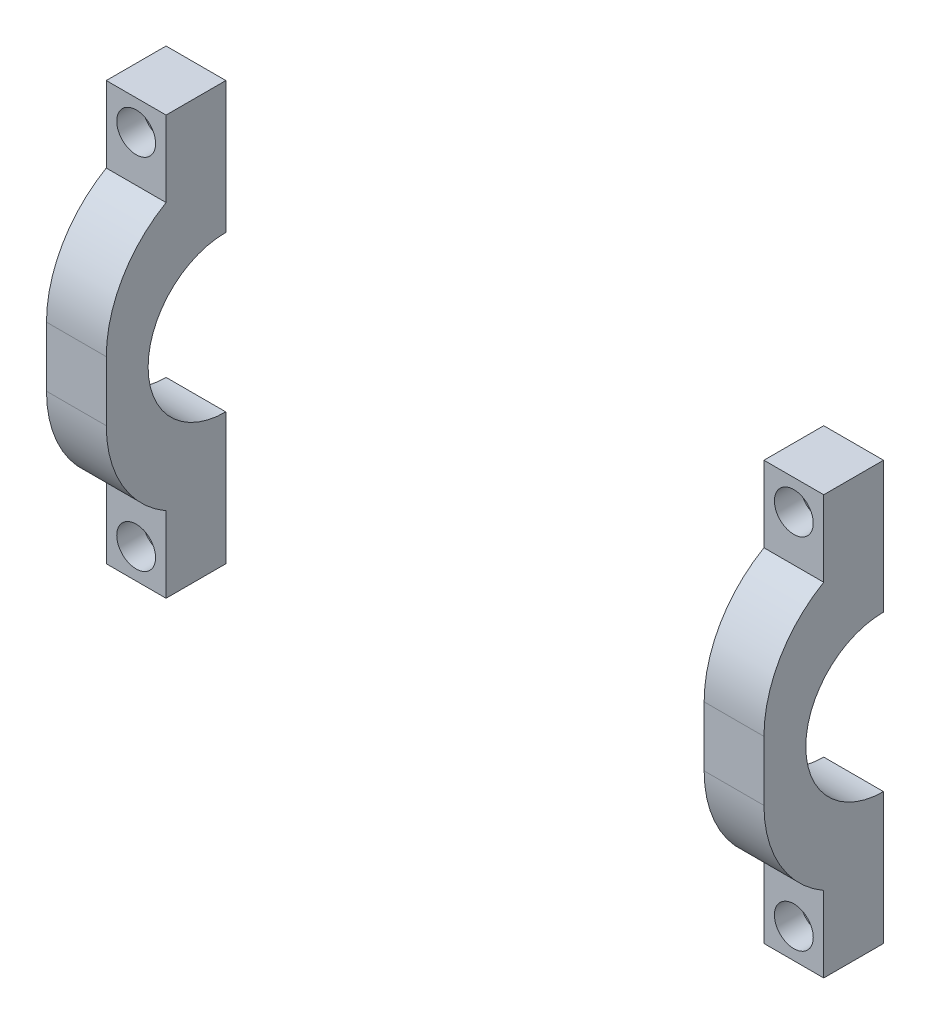
ISO-10303-21;
HEADER;
FILE_DESCRIPTION(('STEP AP214'),'2;1');
FILE_NAME('part.step','',(''),(''),'','','');
FILE_SCHEMA(('AUTOMOTIVE_DESIGN { 1 0 10303 214 1 1 1 1 }'));
ENDSEC;
DATA;
#1=APPLICATION_CONTEXT('core data for automotive mechanical design processes');
#2=APPLICATION_PROTOCOL_DEFINITION('international standard','automotive_design',2000,#1);
#3=PRODUCT_CONTEXT('',#1,'mechanical');
#4=PRODUCT('Part','Part','',(#3));
#5=PRODUCT_RELATED_PRODUCT_CATEGORY('part','',(#4));
#6=PRODUCT_DEFINITION_FORMATION('','',#4);
#7=PRODUCT_DEFINITION_CONTEXT('part definition',#1,'design');
#8=PRODUCT_DEFINITION('design','',#6,#7);
#9=PRODUCT_DEFINITION_SHAPE('','',#8);
#10=(LENGTH_UNIT() NAMED_UNIT(*) SI_UNIT(.MILLI.,.METRE.));
#11=(NAMED_UNIT(*) PLANE_ANGLE_UNIT() SI_UNIT($,.RADIAN.));
#12=(NAMED_UNIT(*) SI_UNIT($,.STERADIAN.) SOLID_ANGLE_UNIT());
#13=UNCERTAINTY_MEASURE_WITH_UNIT(LENGTH_MEASURE(1.E-05),#10,'distance_accuracy_value','');
#14=(GEOMETRIC_REPRESENTATION_CONTEXT(3) GLOBAL_UNCERTAINTY_ASSIGNED_CONTEXT((#13)) GLOBAL_UNIT_ASSIGNED_CONTEXT((#10,
#11,#12)) REPRESENTATION_CONTEXT('',''));
#15=CARTESIAN_POINT('',(0.,0.,0.));
#16=DIRECTION('',(0.,0.,1.));
#17=DIRECTION('',(1.,0.,0.));
#18=AXIS2_PLACEMENT_3D('',#15,#16,#17);
#19=CARTESIAN_POINT('',(-55.,-30.,70.));
#20=DIRECTION('',(0.,0.,-1.));
#21=DIRECTION('',(-1.,0.,0.));
#22=AXIS2_PLACEMENT_3D('',#19,#20,#21);
#23=CYLINDRICAL_SURFACE('',#22,1.7);
#24=CARTESIAN_POINT('',(-55.,-30.,50.));
#25=DIRECTION('',(0.,0.,1.));
#26=DIRECTION('',(1.,0.,0.));
#27=AXIS2_PLACEMENT_3D('',#24,#25,#26);
#28=CIRCLE('',#27,1.7);
#29=CARTESIAN_POINT('',(-53.3,-30.,50.));
#30=VERTEX_POINT('',#29);
#31=EDGE_CURVE('E189',#30,#30,#28,.F.);
#32=ORIENTED_EDGE('',*,*,#31,.T.);
#33=EDGE_LOOP('',(#32));
#34=FACE_BOUND('',#33,.T.);
#35=CARTESIAN_POINT('',(-55.,-30.,55.6));
#36=DIRECTION('',(0.,0.,1.));
#37=DIRECTION('',(1.,0.,0.));
#38=AXIS2_PLACEMENT_3D('',#35,#36,#37);
#39=CIRCLE('',#38,1.7);
#40=CARTESIAN_POINT('',(-53.3,-30.,55.6));
#41=VERTEX_POINT('',#40);
#42=EDGE_CURVE('E188',#41,#41,#39,.F.);
#43=ORIENTED_EDGE('',*,*,#42,.F.);
#44=EDGE_LOOP('',(#43));
#45=FACE_BOUND('',#44,.T.);
#46=ADVANCED_FACE('F52',(#34,#45),#23,.F.);
#47=CARTESIAN_POINT('',(-60.,-5.,50.));
#48=DIRECTION('',(1.,0.,0.));
#49=DIRECTION('',(0.,0.,-1.));
#50=AXIS2_PLACEMENT_3D('',#47,#48,#49);
#51=CYLINDRICAL_SURFACE('',#50,20.);
#52=CARTESIAN_POINT('',(-60.,-5.,50.));
#53=DIRECTION('',(1.,0.,0.));
#54=DIRECTION('',(0.,0.,-1.));
#55=AXIS2_PLACEMENT_3D('',#52,#53,#54);
#56=CIRCLE('',#55,20.);
#57=CARTESIAN_POINT('',(-60.,-22.3205080756888,60.));
#58=VERTEX_POINT('',#57);
#59=CARTESIAN_POINT('',(-60.,-5.,70.));
#60=VERTEX_POINT('',#59);
#61=EDGE_CURVE('E183',#58,#60,#56,.F.);
#62=ORIENTED_EDGE('',*,*,#61,.F.);
#63=DIRECTION('',(1.,0.,0.));
#64=VECTOR('',#63,1.);
#65=CARTESIAN_POINT('',(-60.,-22.3205080756888,60.));
#66=LINE('',#65,#64);
#67=CARTESIAN_POINT('',(-50.,-22.3205080756888,60.));
#68=VERTEX_POINT('',#67);
#69=EDGE_CURVE('E192',#58,#68,#66,.T.);
#70=ORIENTED_EDGE('',*,*,#69,.T.);
#71=CARTESIAN_POINT('',(-50.,-5.,50.));
#72=DIRECTION('',(-1.,0.,0.));
#73=DIRECTION('',(0.,0.,1.));
#74=AXIS2_PLACEMENT_3D('',#71,#72,#73);
#75=CIRCLE('',#74,20.);
#76=CARTESIAN_POINT('',(-50.,-5.,70.));
#77=VERTEX_POINT('',#76);
#78=EDGE_CURVE('E171',#77,#68,#75,.F.);
#79=ORIENTED_EDGE('',*,*,#78,.F.);
#80=DIRECTION('',(1.,0.,0.));
#81=VECTOR('',#80,1.);
#82=CARTESIAN_POINT('',(-60.,-5.,70.));
#83=LINE('',#82,#81);
#84=EDGE_CURVE('E232',#60,#77,#83,.T.);
#85=ORIENTED_EDGE('',*,*,#84,.F.);
#86=EDGE_LOOP('',(#62,#70,#79,#85));
#87=FACE_BOUND('',#86,.T.);
#88=ADVANCED_FACE('F244',(#87),#51,.T.);
#89=CARTESIAN_POINT('',(-55.,30.,70.));
#90=DIRECTION('',(0.,0.,-1.));
#91=DIRECTION('',(-1.,0.,0.));
#92=AXIS2_PLACEMENT_3D('',#89,#90,#91);
#93=CYLINDRICAL_SURFACE('',#92,1.7);
#94=CARTESIAN_POINT('',(-55.,30.,50.));
#95=DIRECTION('',(0.,0.,1.));
#96=DIRECTION('',(1.,0.,0.));
#97=AXIS2_PLACEMENT_3D('',#94,#95,#96);
#98=CIRCLE('',#97,1.7);
#99=CARTESIAN_POINT('',(-53.3,30.,50.));
#100=VERTEX_POINT('',#99);
#101=EDGE_CURVE('E193',#100,#100,#98,.T.);
#102=ORIENTED_EDGE('',*,*,#101,.F.);
#103=EDGE_LOOP('',(#102));
#104=FACE_BOUND('',#103,.T.);
#105=CARTESIAN_POINT('',(-55.,30.,55.6));
#106=DIRECTION('',(0.,0.,1.));
#107=DIRECTION('',(1.,0.,0.));
#108=AXIS2_PLACEMENT_3D('',#105,#106,#107);
#109=CIRCLE('',#108,1.7);
#110=CARTESIAN_POINT('',(-53.3,30.,55.6));
#111=VERTEX_POINT('',#110);
#112=EDGE_CURVE('E220',#111,#111,#109,.T.);
#113=ORIENTED_EDGE('',*,*,#112,.T.);
#114=EDGE_LOOP('',(#113));
#115=FACE_BOUND('',#114,.T.);
#116=ADVANCED_FACE('F261',(#104,#115),#93,.F.);
#117=CARTESIAN_POINT('',(-60.,25.,0.));
#118=DIRECTION('',(1.,0.,0.));
#119=DIRECTION('',(0.,0.,-1.));
#120=AXIS2_PLACEMENT_3D('',#117,#118,#119);
#121=PLANE('',#120);
#122=DIRECTION('',(0.,0.,1.));
#123=VECTOR('',#122,1.);
#124=CARTESIAN_POINT('',(-60.,35.,40.));
#125=LINE('',#124,#123);
#126=CARTESIAN_POINT('',(-60.,35.,50.));
#127=VERTEX_POINT('',#126);
#128=CARTESIAN_POINT('',(-60.,35.,60.));
#129=VERTEX_POINT('',#128);
#130=EDGE_CURVE('E137',#127,#129,#125,.T.);
#131=ORIENTED_EDGE('',*,*,#130,.F.);
#132=DIRECTION('',(0.,1.,0.));
#133=VECTOR('',#132,1.);
#134=CARTESIAN_POINT('',(-60.,-35.,50.));
#135=LINE('',#134,#133);
#136=CARTESIAN_POINT('',(-60.,13.,50.));
#137=VERTEX_POINT('',#136);
#138=EDGE_CURVE('E61',#137,#127,#135,.T.);
#139=ORIENTED_EDGE('',*,*,#138,.F.);
#140=CARTESIAN_POINT('',(-60.,0.,50.));
#141=DIRECTION('',(1.,0.,0.));
#142=DIRECTION('',(0.,0.,-1.));
#143=AXIS2_PLACEMENT_3D('',#140,#141,#142);
#144=CIRCLE('',#143,13.);
#145=CARTESIAN_POINT('',(-60.,-13.,50.));
#146=VERTEX_POINT('',#145);
#147=EDGE_CURVE('E184',#137,#146,#144,.T.);
#148=ORIENTED_EDGE('',*,*,#147,.T.);
#149=CARTESIAN_POINT('',(-60.,-35.,50.));
#150=VERTEX_POINT('',#149);
#151=EDGE_CURVE('E84',#150,#146,#135,.T.);
#152=ORIENTED_EDGE('',*,*,#151,.F.);
#153=DIRECTION('',(0.,0.,1.));
#154=VECTOR('',#153,1.);
#155=CARTESIAN_POINT('',(-60.,-35.,40.));
#156=LINE('',#155,#154);
#157=CARTESIAN_POINT('',(-60.,-35.,60.));
#158=VERTEX_POINT('',#157);
#159=EDGE_CURVE('E181',#150,#158,#156,.T.);
#160=ORIENTED_EDGE('',*,*,#159,.T.);
#161=DIRECTION('',(0.,-1.,0.));
#162=VECTOR('',#161,1.);
#163=CARTESIAN_POINT('',(-60.,-15.,60.));
#164=LINE('',#163,#162);
#165=EDGE_CURVE('E172',#58,#158,#164,.T.);
#166=ORIENTED_EDGE('',*,*,#165,.F.);
#167=ORIENTED_EDGE('',*,*,#61,.T.);
#168=DIRECTION('',(0.,-1.,0.));
#169=VECTOR('',#168,1.);
#170=CARTESIAN_POINT('',(-60.,25.,70.));
#171=LINE('',#170,#169);
#172=CARTESIAN_POINT('',(-60.,5.,70.));
#173=VERTEX_POINT('',#172);
#174=EDGE_CURVE('E157',#173,#60,#171,.T.);
#175=ORIENTED_EDGE('',*,*,#174,.F.);
#176=CARTESIAN_POINT('',(-60.,5.,50.));
#177=DIRECTION('',(1.,0.,0.));
#178=DIRECTION('',(0.,0.,-1.));
#179=AXIS2_PLACEMENT_3D('',#176,#177,#178);
#180=CIRCLE('',#179,20.);
#181=CARTESIAN_POINT('',(-60.,22.3205080756888,60.));
#182=VERTEX_POINT('',#181);
#183=EDGE_CURVE('E154',#173,#182,#180,.F.);
#184=ORIENTED_EDGE('',*,*,#183,.T.);
#185=DIRECTION('',(0.,1.,0.));
#186=VECTOR('',#185,1.);
#187=CARTESIAN_POINT('',(-60.,15.,60.));
#188=LINE('',#187,#186);
#189=EDGE_CURVE('E150',#182,#129,#188,.T.);
#190=ORIENTED_EDGE('',*,*,#189,.T.);
#191=EDGE_LOOP('',(#131,#139,#148,#152,#160,#166,#167,#175,#184,#190));
#192=FACE_BOUND('',#191,.T.);
#193=ADVANCED_FACE('F151',(#192),#121,.F.);
#194=CARTESIAN_POINT('',(-60.,25.,70.));
#195=DIRECTION('',(0.,0.,-1.));
#196=DIRECTION('',(-1.,0.,0.));
#197=AXIS2_PLACEMENT_3D('',#194,#195,#196);
#198=PLANE('',#197);
#199=ORIENTED_EDGE('',*,*,#174,.T.);
#200=ORIENTED_EDGE('',*,*,#84,.T.);
#201=DIRECTION('',(0.,-1.,0.));
#202=VECTOR('',#201,1.);
#203=CARTESIAN_POINT('',(-50.,25.,70.));
#204=LINE('',#203,#202);
#205=CARTESIAN_POINT('',(-50.,5.,70.));
#206=VERTEX_POINT('',#205);
#207=EDGE_CURVE('E218',#206,#77,#204,.T.);
#208=ORIENTED_EDGE('',*,*,#207,.F.);
#209=DIRECTION('',(1.,0.,0.));
#210=VECTOR('',#209,1.);
#211=CARTESIAN_POINT('',(-60.,5.,70.));
#212=LINE('',#211,#210);
#213=EDGE_CURVE('E180',#206,#173,#212,.F.);
#214=ORIENTED_EDGE('',*,*,#213,.T.);
#215=EDGE_LOOP('',(#199,#200,#208,#214));
#216=FACE_BOUND('',#215,.T.);
#217=ADVANCED_FACE('F238',(#216),#198,.F.);
#218=CARTESIAN_POINT('',(-50.,25.,70.));
#219=DIRECTION('',(-1.,0.,0.));
#220=DIRECTION('',(0.,0.,1.));
#221=AXIS2_PLACEMENT_3D('',#218,#219,#220);
#222=PLANE('',#221);
#223=DIRECTION('',(0.,0.,-1.));
#224=VECTOR('',#223,1.);
#225=CARTESIAN_POINT('',(-50.,-35.,40.));
#226=LINE('',#225,#224);
#227=CARTESIAN_POINT('',(-50.,-35.,60.));
#228=VERTEX_POINT('',#227);
#229=CARTESIAN_POINT('',(-50.,-35.,50.));
#230=VERTEX_POINT('',#229);
#231=EDGE_CURVE('E177',#228,#230,#226,.T.);
#232=ORIENTED_EDGE('',*,*,#231,.T.);
#233=DIRECTION('',(0.,1.,0.));
#234=VECTOR('',#233,1.);
#235=CARTESIAN_POINT('',(-50.,25.,50.));
#236=LINE('',#235,#234);
#237=CARTESIAN_POINT('',(-50.,-13.,50.));
#238=VERTEX_POINT('',#237);
#239=EDGE_CURVE('E179',#230,#238,#236,.T.);
#240=ORIENTED_EDGE('',*,*,#239,.T.);
#241=CARTESIAN_POINT('',(-50.,0.,50.));
#242=DIRECTION('',(-1.,0.,0.));
#243=DIRECTION('',(0.,0.,1.));
#244=AXIS2_PLACEMENT_3D('',#241,#242,#243);
#245=CIRCLE('',#244,13.);
#246=CARTESIAN_POINT('',(-50.,13.,50.));
#247=VERTEX_POINT('',#246);
#248=EDGE_CURVE('E199',#238,#247,#245,.T.);
#249=ORIENTED_EDGE('',*,*,#248,.T.);
#250=CARTESIAN_POINT('',(-50.,35.,50.));
#251=VERTEX_POINT('',#250);
#252=EDGE_CURVE('E68',#247,#251,#236,.T.);
#253=ORIENTED_EDGE('',*,*,#252,.T.);
#254=DIRECTION('',(0.,0.,-1.));
#255=VECTOR('',#254,1.);
#256=CARTESIAN_POINT('',(-50.,35.,40.));
#257=LINE('',#256,#255);
#258=CARTESIAN_POINT('',(-50.,35.,60.));
#259=VERTEX_POINT('',#258);
#260=EDGE_CURVE('E160',#259,#251,#257,.T.);
#261=ORIENTED_EDGE('',*,*,#260,.F.);
#262=DIRECTION('',(0.,1.,0.));
#263=VECTOR('',#262,1.);
#264=CARTESIAN_POINT('',(-50.,15.,60.));
#265=LINE('',#264,#263);
#266=CARTESIAN_POINT('',(-50.,22.3205080756888,60.));
#267=VERTEX_POINT('',#266);
#268=EDGE_CURVE('E146',#267,#259,#265,.T.);
#269=ORIENTED_EDGE('',*,*,#268,.F.);
#270=CARTESIAN_POINT('',(-50.,5.,50.));
#271=DIRECTION('',(-1.,0.,0.));
#272=DIRECTION('',(0.,0.,1.));
#273=AXIS2_PLACEMENT_3D('',#270,#271,#272);
#274=CIRCLE('',#273,20.);
#275=EDGE_CURVE('E123',#267,#206,#274,.F.);
#276=ORIENTED_EDGE('',*,*,#275,.T.);
#277=ORIENTED_EDGE('',*,*,#207,.T.);
#278=ORIENTED_EDGE('',*,*,#78,.T.);
#279=DIRECTION('',(0.,-1.,0.));
#280=VECTOR('',#279,1.);
#281=CARTESIAN_POINT('',(-50.,-15.,60.));
#282=LINE('',#281,#280);
#283=EDGE_CURVE('E97',#68,#228,#282,.T.);
#284=ORIENTED_EDGE('',*,*,#283,.T.);
#285=EDGE_LOOP('',(#232,#240,#249,#253,#261,#269,#276,#277,#278,#284));
#286=FACE_BOUND('',#285,.T.);
#287=ADVANCED_FACE('F208',(#286),#222,.F.);
#288=CARTESIAN_POINT('',(0.,5.,50.));
#289=DIRECTION('',(-1.,0.,0.));
#290=DIRECTION('',(0.,0.,1.));
#291=AXIS2_PLACEMENT_3D('',#288,#289,#290);
#292=CYLINDRICAL_SURFACE('',#291,20.);
#293=DIRECTION('',(-1.,0.,0.));
#294=VECTOR('',#293,1.);
#295=CARTESIAN_POINT('',(0.,22.3205080756888,60.));
#296=LINE('',#295,#294);
#297=EDGE_CURVE('E221',#182,#267,#296,.F.);
#298=ORIENTED_EDGE('',*,*,#297,.F.);
#299=ORIENTED_EDGE('',*,*,#183,.F.);
#300=ORIENTED_EDGE('',*,*,#213,.F.);
#301=ORIENTED_EDGE('',*,*,#275,.F.);
#302=EDGE_LOOP('',(#298,#299,#300,#301));
#303=FACE_BOUND('',#302,.T.);
#304=ADVANCED_FACE('F246',(#303),#292,.T.);
#305=CARTESIAN_POINT('',(-60.,0.,50.));
#306=DIRECTION('',(1.,0.,0.));
#307=DIRECTION('',(0.,0.,-1.));
#308=AXIS2_PLACEMENT_3D('',#305,#306,#307);
#309=CYLINDRICAL_SURFACE('',#308,13.);
#310=ORIENTED_EDGE('',*,*,#248,.F.);
#311=DIRECTION('',(1.,0.,0.));
#312=VECTOR('',#311,1.);
#313=CARTESIAN_POINT('',(-60.,-13.,50.));
#314=LINE('',#313,#312);
#315=EDGE_CURVE('E170',#238,#146,#314,.F.);
#316=ORIENTED_EDGE('',*,*,#315,.T.);
#317=ORIENTED_EDGE('',*,*,#147,.F.);
#318=DIRECTION('',(1.,0.,0.));
#319=VECTOR('',#318,1.);
#320=CARTESIAN_POINT('',(-60.,13.,50.));
#321=LINE('',#320,#319);
#322=EDGE_CURVE('E197',#137,#247,#321,.T.);
#323=ORIENTED_EDGE('',*,*,#322,.T.);
#324=EDGE_LOOP('',(#310,#316,#317,#323));
#325=FACE_BOUND('',#324,.T.);
#326=ADVANCED_FACE('F212',(#325),#309,.F.);
#327=CARTESIAN_POINT('',(-60.,15.,60.));
#328=DIRECTION('',(0.,0.,1.));
#329=DIRECTION('',(1.,0.,0.));
#330=AXIS2_PLACEMENT_3D('',#327,#328,#329);
#331=PLANE('',#330);
#332=CARTESIAN_POINT('',(-55.,30.,60.));
#333=DIRECTION('',(0.,0.,1.));
#334=DIRECTION('',(1.,0.,0.));
#335=AXIS2_PLACEMENT_3D('',#332,#333,#334);
#336=CIRCLE('',#335,3.25);
#337=CARTESIAN_POINT('',(-51.75,30.,60.));
#338=VERTEX_POINT('',#337);
#339=EDGE_CURVE('E201',#338,#338,#336,.F.);
#340=ORIENTED_EDGE('',*,*,#339,.T.);
#341=EDGE_LOOP('',(#340));
#342=FACE_BOUND('',#341,.T.);
#343=ORIENTED_EDGE('',*,*,#189,.F.);
#344=ORIENTED_EDGE('',*,*,#297,.T.);
#345=ORIENTED_EDGE('',*,*,#268,.T.);
#346=DIRECTION('',(1.,0.,0.));
#347=VECTOR('',#346,1.);
#348=CARTESIAN_POINT('',(-60.,35.,60.));
#349=LINE('',#348,#347);
#350=EDGE_CURVE('E142',#129,#259,#349,.T.);
#351=ORIENTED_EDGE('',*,*,#350,.F.);
#352=EDGE_LOOP('',(#343,#344,#345,#351));
#353=FACE_BOUND('',#352,.T.);
#354=ADVANCED_FACE('F159',(#342,#353),#331,.T.);
#355=CARTESIAN_POINT('',(0.,35.,0.));
#356=DIRECTION('',(0.,1.,0.));
#357=DIRECTION('',(0.,0.,1.));
#358=AXIS2_PLACEMENT_3D('',#355,#356,#357);
#359=PLANE('',#358);
#360=DIRECTION('',(1.,0.,0.));
#361=VECTOR('',#360,1.);
#362=CARTESIAN_POINT('',(-60.,35.,50.));
#363=LINE('',#362,#361);
#364=EDGE_CURVE('E12',#127,#251,#363,.T.);
#365=ORIENTED_EDGE('',*,*,#364,.F.);
#366=ORIENTED_EDGE('',*,*,#130,.T.);
#367=ORIENTED_EDGE('',*,*,#350,.T.);
#368=ORIENTED_EDGE('',*,*,#260,.T.);
#369=EDGE_LOOP('',(#365,#366,#367,#368));
#370=FACE_BOUND('',#369,.T.);
#371=ADVANCED_FACE('F139',(#370),#359,.T.);
#372=CARTESIAN_POINT('',(-55.,30.,70.));
#373=DIRECTION('',(0.,0.,-1.));
#374=DIRECTION('',(-1.,0.,0.));
#375=AXIS2_PLACEMENT_3D('',#372,#373,#374);
#376=CYLINDRICAL_SURFACE('',#375,3.25);
#377=ORIENTED_EDGE('',*,*,#339,.F.);
#378=EDGE_LOOP('',(#377));
#379=FACE_BOUND('',#378,.T.);
#380=CARTESIAN_POINT('',(-55.,30.,55.6));
#381=DIRECTION('',(0.,0.,1.));
#382=DIRECTION('',(1.,0.,0.));
#383=AXIS2_PLACEMENT_3D('',#380,#381,#382);
#384=CIRCLE('',#383,3.25);
#385=CARTESIAN_POINT('',(-51.75,30.,55.6));
#386=VERTEX_POINT('',#385);
#387=EDGE_CURVE('E162',#386,#386,#384,.T.);
#388=ORIENTED_EDGE('',*,*,#387,.F.);
#389=EDGE_LOOP('',(#388));
#390=FACE_BOUND('',#389,.T.);
#391=ADVANCED_FACE('F292',(#379,#390),#376,.F.);
#392=CARTESIAN_POINT('',(-55.,30.,55.6));
#393=DIRECTION('',(0.,0.,1.));
#394=DIRECTION('',(1.,0.,0.));
#395=AXIS2_PLACEMENT_3D('',#392,#393,#394);
#396=PLANE('',#395);
#397=ORIENTED_EDGE('',*,*,#112,.F.);
#398=EDGE_LOOP('',(#397));
#399=FACE_BOUND('',#398,.T.);
#400=ORIENTED_EDGE('',*,*,#387,.T.);
#401=EDGE_LOOP('',(#400));
#402=FACE_BOUND('',#401,.T.);
#403=ADVANCED_FACE('F288',(#399,#402),#396,.T.);
#404=CARTESIAN_POINT('',(-60.,-15.,60.));
#405=DIRECTION('',(0.,0.,-1.));
#406=DIRECTION('',(-1.,0.,0.));
#407=AXIS2_PLACEMENT_3D('',#404,#405,#406);
#408=PLANE('',#407);
#409=CARTESIAN_POINT('',(-55.,-30.,60.));
#410=DIRECTION('',(0.,0.,-1.));
#411=DIRECTION('',(-1.,0.,0.));
#412=AXIS2_PLACEMENT_3D('',#409,#410,#411);
#413=CIRCLE('',#412,3.25);
#414=CARTESIAN_POINT('',(-58.25,-30.,60.));
#415=VERTEX_POINT('',#414);
#416=EDGE_CURVE('E168',#415,#415,#413,.T.);
#417=ORIENTED_EDGE('',*,*,#416,.T.);
#418=EDGE_LOOP('',(#417));
#419=FACE_BOUND('',#418,.T.);
#420=ORIENTED_EDGE('',*,*,#69,.F.);
#421=ORIENTED_EDGE('',*,*,#165,.T.);
#422=DIRECTION('',(1.,0.,0.));
#423=VECTOR('',#422,1.);
#424=CARTESIAN_POINT('',(-60.,-35.,60.));
#425=LINE('',#424,#423);
#426=EDGE_CURVE('E175',#158,#228,#425,.T.);
#427=ORIENTED_EDGE('',*,*,#426,.T.);
#428=ORIENTED_EDGE('',*,*,#283,.F.);
#429=EDGE_LOOP('',(#420,#421,#427,#428));
#430=FACE_BOUND('',#429,.T.);
#431=ADVANCED_FACE('F291',(#419,#430),#408,.F.);
#432=CARTESIAN_POINT('',(0.,-35.,0.));
#433=DIRECTION('',(0.,-1.,0.));
#434=DIRECTION('',(0.,0.,1.));
#435=AXIS2_PLACEMENT_3D('',#432,#433,#434);
#436=PLANE('',#435);
#437=DIRECTION('',(1.,0.,0.));
#438=VECTOR('',#437,1.);
#439=CARTESIAN_POINT('',(-60.,-35.,50.));
#440=LINE('',#439,#438);
#441=EDGE_CURVE('E89',#150,#230,#440,.T.);
#442=ORIENTED_EDGE('',*,*,#441,.T.);
#443=ORIENTED_EDGE('',*,*,#231,.F.);
#444=ORIENTED_EDGE('',*,*,#426,.F.);
#445=ORIENTED_EDGE('',*,*,#159,.F.);
#446=EDGE_LOOP('',(#442,#443,#444,#445));
#447=FACE_BOUND('',#446,.T.);
#448=ADVANCED_FACE('F204',(#447),#436,.T.);
#449=CARTESIAN_POINT('',(-55.,-30.,70.));
#450=DIRECTION('',(0.,0.,-1.));
#451=DIRECTION('',(-1.,0.,0.));
#452=AXIS2_PLACEMENT_3D('',#449,#450,#451);
#453=CYLINDRICAL_SURFACE('',#452,3.25);
#454=CARTESIAN_POINT('',(-55.,-30.,55.6));
#455=DIRECTION('',(0.,0.,-1.));
#456=DIRECTION('',(1.,0.,0.));
#457=AXIS2_PLACEMENT_3D('',#454,#455,#456);
#458=CIRCLE('',#457,3.25);
#459=CARTESIAN_POINT('',(-51.75,-30.,55.6));
#460=VERTEX_POINT('',#459);
#461=EDGE_CURVE('E185',#460,#460,#458,.T.);
#462=ORIENTED_EDGE('',*,*,#461,.T.);
#463=EDGE_LOOP('',(#462));
#464=FACE_BOUND('',#463,.T.);
#465=ORIENTED_EDGE('',*,*,#416,.F.);
#466=EDGE_LOOP('',(#465));
#467=FACE_BOUND('',#466,.T.);
#468=ADVANCED_FACE('F266',(#464,#467),#453,.F.);
#469=CARTESIAN_POINT('',(-55.,-30.,55.6));
#470=DIRECTION('',(0.,0.,1.));
#471=DIRECTION('',(1.,0.,0.));
#472=AXIS2_PLACEMENT_3D('',#469,#470,#471);
#473=PLANE('',#472);
#474=ORIENTED_EDGE('',*,*,#461,.F.);
#475=EDGE_LOOP('',(#474));
#476=FACE_BOUND('',#475,.T.);
#477=ORIENTED_EDGE('',*,*,#42,.T.);
#478=EDGE_LOOP('',(#477));
#479=FACE_BOUND('',#478,.T.);
#480=ADVANCED_FACE('F269',(#476,#479),#473,.T.);
#481=CARTESIAN_POINT('',(-60.,-35.,50.));
#482=DIRECTION('',(0.,0.,1.));
#483=DIRECTION('',(1.,0.,0.));
#484=AXIS2_PLACEMENT_3D('',#481,#482,#483);
#485=PLANE('',#484);
#486=ORIENTED_EDGE('',*,*,#441,.F.);
#487=ORIENTED_EDGE('',*,*,#151,.T.);
#488=ORIENTED_EDGE('',*,*,#315,.F.);
#489=ORIENTED_EDGE('',*,*,#239,.F.);
#490=EDGE_LOOP('',(#486,#487,#488,#489));
#491=FACE_BOUND('',#490,.T.);
#492=ORIENTED_EDGE('',*,*,#31,.F.);
#493=EDGE_LOOP('',(#492));
#494=FACE_BOUND('',#493,.T.);
#495=ADVANCED_FACE('F54',(#491,#494),#485,.F.);
#496=ORIENTED_EDGE('',*,*,#101,.T.);
#497=EDGE_LOOP('',(#496));
#498=FACE_BOUND('',#497,.T.);
#499=ORIENTED_EDGE('',*,*,#322,.F.);
#500=ORIENTED_EDGE('',*,*,#138,.T.);
#501=ORIENTED_EDGE('',*,*,#364,.T.);
#502=ORIENTED_EDGE('',*,*,#252,.F.);
#503=EDGE_LOOP('',(#499,#500,#501,#502));
#504=FACE_BOUND('',#503,.T.);
#505=ADVANCED_FACE('F276',(#498,#504),#485,.F.);
#506=CLOSED_SHELL('',(#46,#88,#116,#193,#217,#287,#304,#326,#354,#371,#391,#403,#431,#448,#468,
#480,#495,#505));
#507=MANIFOLD_SOLID_BREP('B2',#506);
#508=CARTESIAN_POINT('',(55.,30.,55.6));
#509=DIRECTION('',(0.,0.,1.));
#510=DIRECTION('',(-1.,0.,0.));
#511=AXIS2_PLACEMENT_3D('',#508,#509,#510);
#512=PLANE('',#511);
#513=CARTESIAN_POINT('',(55.,30.,55.6));
#514=DIRECTION('',(0.,0.,-1.));
#515=DIRECTION('',(-1.,0.,0.));
#516=AXIS2_PLACEMENT_3D('',#513,#514,#515);
#517=CIRCLE('',#516,3.25);
#518=CARTESIAN_POINT('',(51.75,30.,55.6));
#519=VERTEX_POINT('',#518);
#520=EDGE_CURVE('E587',#519,#519,#517,.T.);
#521=ORIENTED_EDGE('',*,*,#520,.F.);
#522=EDGE_LOOP('',(#521));
#523=FACE_BOUND('',#522,.T.);
#524=CARTESIAN_POINT('',(55.,30.,55.6));
#525=DIRECTION('',(0.,0.,1.));
#526=DIRECTION('',(1.,0.,0.));
#527=AXIS2_PLACEMENT_3D('',#524,#525,#526);
#528=CIRCLE('',#527,1.7);
#529=CARTESIAN_POINT('',(56.7,30.,55.6));
#530=VERTEX_POINT('',#529);
#531=EDGE_CURVE('E583',#530,#530,#528,.F.);
#532=ORIENTED_EDGE('',*,*,#531,.T.);
#533=EDGE_LOOP('',(#532));
#534=FACE_BOUND('',#533,.T.);
#535=ADVANCED_FACE('F442',(#523,#534),#512,.T.);
#536=CARTESIAN_POINT('',(55.,30.,70.));
#537=DIRECTION('',(0.,0.,-1.));
#538=DIRECTION('',(-1.,0.,0.));
#539=AXIS2_PLACEMENT_3D('',#536,#537,#538);
#540=CYLINDRICAL_SURFACE('',#539,1.7);
#541=CARTESIAN_POINT('',(55.,30.,50.));
#542=DIRECTION('',(0.,0.,1.));
#543=DIRECTION('',(1.,0.,0.));
#544=AXIS2_PLACEMENT_3D('',#541,#542,#543);
#545=CIRCLE('',#544,1.7);
#546=CARTESIAN_POINT('',(56.7,30.,50.));
#547=VERTEX_POINT('',#546);
#548=EDGE_CURVE('E626',#547,#547,#545,.F.);
#549=ORIENTED_EDGE('',*,*,#548,.T.);
#550=EDGE_LOOP('',(#549));
#551=FACE_BOUND('',#550,.T.);
#552=ORIENTED_EDGE('',*,*,#531,.F.);
#553=EDGE_LOOP('',(#552));
#554=FACE_BOUND('',#553,.T.);
#555=ADVANCED_FACE('F649',(#551,#554),#540,.F.);
#556=CARTESIAN_POINT('',(55.,30.,70.));
#557=DIRECTION('',(0.,0.,-1.));
#558=DIRECTION('',(-1.,0.,0.));
#559=AXIS2_PLACEMENT_3D('',#556,#557,#558);
#560=CYLINDRICAL_SURFACE('',#559,3.25);
#561=ORIENTED_EDGE('',*,*,#520,.T.);
#562=EDGE_LOOP('',(#561));
#563=FACE_BOUND('',#562,.T.);
#564=CARTESIAN_POINT('',(55.,30.,60.));
#565=DIRECTION('',(0.,0.,-1.));
#566=DIRECTION('',(-1.,0.,0.));
#567=AXIS2_PLACEMENT_3D('',#564,#565,#566);
#568=CIRCLE('',#567,3.25);
#569=CARTESIAN_POINT('',(51.75,30.,60.));
#570=VERTEX_POINT('',#569);
#571=EDGE_CURVE('E586',#570,#570,#568,.T.);
#572=ORIENTED_EDGE('',*,*,#571,.F.);
#573=EDGE_LOOP('',(#572));
#574=FACE_BOUND('',#573,.T.);
#575=ADVANCED_FACE('F657',(#563,#574),#560,.F.);
#576=CARTESIAN_POINT('',(55.,-30.,55.6));
#577=DIRECTION('',(0.,0.,1.));
#578=DIRECTION('',(-1.,0.,0.));
#579=AXIS2_PLACEMENT_3D('',#576,#577,#578);
#580=PLANE('',#579);
#581=CARTESIAN_POINT('',(55.,-30.,55.6));
#582=DIRECTION('',(0.,0.,1.));
#583=DIRECTION('',(1.,0.,0.));
#584=AXIS2_PLACEMENT_3D('',#581,#582,#583);
#585=CIRCLE('',#584,1.7);
#586=CARTESIAN_POINT('',(56.7,-30.,55.6));
#587=VERTEX_POINT('',#586);
#588=EDGE_CURVE('E591',#587,#587,#585,.T.);
#589=ORIENTED_EDGE('',*,*,#588,.F.);
#590=EDGE_LOOP('',(#589));
#591=FACE_BOUND('',#590,.T.);
#592=CARTESIAN_POINT('',(55.,-30.,55.6));
#593=DIRECTION('',(0.,0.,1.));
#594=DIRECTION('',(-1.,0.,0.));
#595=AXIS2_PLACEMENT_3D('',#592,#593,#594);
#596=CIRCLE('',#595,3.25);
#597=CARTESIAN_POINT('',(51.75,-30.,55.6));
#598=VERTEX_POINT('',#597);
#599=EDGE_CURVE('E594',#598,#598,#596,.T.);
#600=ORIENTED_EDGE('',*,*,#599,.T.);
#601=EDGE_LOOP('',(#600));
#602=FACE_BOUND('',#601,.T.);
#603=ADVANCED_FACE('F665',(#591,#602),#580,.T.);
#604=CARTESIAN_POINT('',(55.,-30.,70.));
#605=DIRECTION('',(0.,0.,-1.));
#606=DIRECTION('',(-1.,0.,0.));
#607=AXIS2_PLACEMENT_3D('',#604,#605,#606);
#608=CYLINDRICAL_SURFACE('',#607,1.7);
#609=CARTESIAN_POINT('',(55.,-30.,50.));
#610=DIRECTION('',(0.,0.,1.));
#611=DIRECTION('',(1.,0.,0.));
#612=AXIS2_PLACEMENT_3D('',#609,#610,#611);
#613=CIRCLE('',#612,1.7);
#614=CARTESIAN_POINT('',(56.7,-30.,50.));
#615=VERTEX_POINT('',#614);
#616=EDGE_CURVE('E630',#615,#615,#613,.T.);
#617=ORIENTED_EDGE('',*,*,#616,.F.);
#618=EDGE_LOOP('',(#617));
#619=FACE_BOUND('',#618,.T.);
#620=ORIENTED_EDGE('',*,*,#588,.T.);
#621=EDGE_LOOP('',(#620));
#622=FACE_BOUND('',#621,.T.);
#623=ADVANCED_FACE('F666',(#619,#622),#608,.F.);
#624=CARTESIAN_POINT('',(55.,-30.,70.));
#625=DIRECTION('',(0.,0.,-1.));
#626=DIRECTION('',(-1.,0.,0.));
#627=AXIS2_PLACEMENT_3D('',#624,#625,#626);
#628=CYLINDRICAL_SURFACE('',#627,3.25);
#629=CARTESIAN_POINT('',(55.,-30.,60.));
#630=DIRECTION('',(0.,0.,1.));
#631=DIRECTION('',(1.,0.,0.));
#632=AXIS2_PLACEMENT_3D('',#629,#630,#631);
#633=CIRCLE('',#632,3.25);
#634=CARTESIAN_POINT('',(58.25,-30.,60.));
#635=VERTEX_POINT('',#634);
#636=EDGE_CURVE('E593',#635,#635,#633,.F.);
#637=ORIENTED_EDGE('',*,*,#636,.F.);
#638=EDGE_LOOP('',(#637));
#639=FACE_BOUND('',#638,.T.);
#640=ORIENTED_EDGE('',*,*,#599,.F.);
#641=EDGE_LOOP('',(#640));
#642=FACE_BOUND('',#641,.T.);
#643=ADVANCED_FACE('F663',(#639,#642),#628,.F.);
#644=CARTESIAN_POINT('',(50.,-5.,50.));
#645=DIRECTION('',(1.,0.,0.));
#646=DIRECTION('',(0.,0.,-1.));
#647=AXIS2_PLACEMENT_3D('',#644,#645,#646);
#648=CYLINDRICAL_SURFACE('',#647,20.);
#649=DIRECTION('',(1.,0.,0.));
#650=VECTOR('',#649,1.);
#651=CARTESIAN_POINT('',(50.,-22.3205080756888,60.));
#652=LINE('',#651,#650);
#653=CARTESIAN_POINT('',(60.,-22.3205080756888,60.));
#654=VERTEX_POINT('',#653);
#655=CARTESIAN_POINT('',(50.,-22.3205080756888,60.));
#656=VERTEX_POINT('',#655);
#657=EDGE_CURVE('E450',#654,#656,#652,.F.);
#658=ORIENTED_EDGE('',*,*,#657,.F.);
#659=CARTESIAN_POINT('',(60.,-5.,50.));
#660=DIRECTION('',(-1.,0.,0.));
#661=DIRECTION('',(0.,0.,1.));
#662=AXIS2_PLACEMENT_3D('',#659,#660,#661);
#663=CIRCLE('',#662,20.);
#664=CARTESIAN_POINT('',(60.,-5.,70.));
#665=VERTEX_POINT('',#664);
#666=EDGE_CURVE('E563',#665,#654,#663,.F.);
#667=ORIENTED_EDGE('',*,*,#666,.F.);
#668=DIRECTION('',(1.,0.,0.));
#669=VECTOR('',#668,1.);
#670=CARTESIAN_POINT('',(50.,-5.,70.));
#671=LINE('',#670,#669);
#672=CARTESIAN_POINT('',(50.,-5.,70.));
#673=VERTEX_POINT('',#672);
#674=EDGE_CURVE('E568',#673,#665,#671,.T.);
#675=ORIENTED_EDGE('',*,*,#674,.F.);
#676=CARTESIAN_POINT('',(50.,-5.,50.));
#677=DIRECTION('',(1.,0.,0.));
#678=DIRECTION('',(0.,0.,-1.));
#679=AXIS2_PLACEMENT_3D('',#676,#677,#678);
#680=CIRCLE('',#679,20.);
#681=EDGE_CURVE('E573',#656,#673,#680,.F.);
#682=ORIENTED_EDGE('',*,*,#681,.F.);
#683=EDGE_LOOP('',(#658,#667,#675,#682));
#684=FACE_BOUND('',#683,.T.);
#685=ADVANCED_FACE('F444',(#684),#648,.T.);
#686=CARTESIAN_POINT('',(50.,25.,70.));
#687=DIRECTION('',(0.,0.,-1.));
#688=DIRECTION('',(-1.,0.,0.));
#689=AXIS2_PLACEMENT_3D('',#686,#687,#688);
#690=PLANE('',#689);
#691=DIRECTION('',(0.,-1.,0.));
#692=VECTOR('',#691,1.);
#693=CARTESIAN_POINT('',(60.,25.,70.));
#694=LINE('',#693,#692);
#695=CARTESIAN_POINT('',(60.,5.,70.));
#696=VERTEX_POINT('',#695);
#697=EDGE_CURVE('E557',#696,#665,#694,.T.);
#698=ORIENTED_EDGE('',*,*,#697,.F.);
#699=DIRECTION('',(1.,0.,0.));
#700=VECTOR('',#699,1.);
#701=CARTESIAN_POINT('',(50.,5.,70.));
#702=LINE('',#701,#700);
#703=CARTESIAN_POINT('',(50.,5.,70.));
#704=VERTEX_POINT('',#703);
#705=EDGE_CURVE('E571',#696,#704,#702,.F.);
#706=ORIENTED_EDGE('',*,*,#705,.T.);
#707=DIRECTION('',(0.,-1.,0.));
#708=VECTOR('',#707,1.);
#709=CARTESIAN_POINT('',(50.,25.,70.));
#710=LINE('',#709,#708);
#711=EDGE_CURVE('E560',#704,#673,#710,.T.);
#712=ORIENTED_EDGE('',*,*,#711,.T.);
#713=ORIENTED_EDGE('',*,*,#674,.T.);
#714=EDGE_LOOP('',(#698,#706,#712,#713));
#715=FACE_BOUND('',#714,.T.);
#716=ADVANCED_FACE('F685',(#715),#690,.F.);
#717=CARTESIAN_POINT('',(0.,5.,50.));
#718=DIRECTION('',(-1.,0.,0.));
#719=DIRECTION('',(0.,0.,1.));
#720=AXIS2_PLACEMENT_3D('',#717,#718,#719);
#721=CYLINDRICAL_SURFACE('',#720,20.);
#722=CARTESIAN_POINT('',(60.,5.,50.));
#723=DIRECTION('',(-1.,0.,0.));
#724=DIRECTION('',(0.,0.,1.));
#725=AXIS2_PLACEMENT_3D('',#722,#723,#724);
#726=CIRCLE('',#725,20.);
#727=CARTESIAN_POINT('',(60.,22.3205080756888,60.));
#728=VERTEX_POINT('',#727);
#729=EDGE_CURVE('E566',#728,#696,#726,.F.);
#730=ORIENTED_EDGE('',*,*,#729,.F.);
#731=DIRECTION('',(-1.,0.,0.));
#732=VECTOR('',#731,1.);
#733=CARTESIAN_POINT('',(0.,22.3205080756888,60.));
#734=LINE('',#733,#732);
#735=CARTESIAN_POINT('',(50.,22.3205080756888,60.));
#736=VERTEX_POINT('',#735);
#737=EDGE_CURVE('E578',#728,#736,#734,.T.);
#738=ORIENTED_EDGE('',*,*,#737,.T.);
#739=CARTESIAN_POINT('',(50.,5.,50.));
#740=DIRECTION('',(1.,0.,0.));
#741=DIRECTION('',(0.,0.,-1.));
#742=AXIS2_PLACEMENT_3D('',#739,#740,#741);
#743=CIRCLE('',#742,20.);
#744=EDGE_CURVE('E575',#704,#736,#743,.F.);
#745=ORIENTED_EDGE('',*,*,#744,.F.);
#746=ORIENTED_EDGE('',*,*,#705,.F.);
#747=EDGE_LOOP('',(#730,#738,#745,#746));
#748=FACE_BOUND('',#747,.T.);
#749=ADVANCED_FACE('F679',(#748),#721,.T.);
#750=CARTESIAN_POINT('',(60.,15.,60.));
#751=DIRECTION('',(0.,0.,-1.));
#752=DIRECTION('',(-1.,0.,0.));
#753=AXIS2_PLACEMENT_3D('',#750,#751,#752);
#754=PLANE('',#753);
#755=ORIENTED_EDGE('',*,*,#571,.T.);
#756=EDGE_LOOP('',(#755));
#757=FACE_BOUND('',#756,.T.);
#758=ORIENTED_EDGE('',*,*,#737,.F.);
#759=DIRECTION('',(0.,1.,0.));
#760=VECTOR('',#759,1.);
#761=CARTESIAN_POINT('',(60.,15.,60.));
#762=LINE('',#761,#760);
#763=CARTESIAN_POINT('',(60.,35.,60.));
#764=VERTEX_POINT('',#763);
#765=EDGE_CURVE('E550',#728,#764,#762,.T.);
#766=ORIENTED_EDGE('',*,*,#765,.T.);
#767=DIRECTION('',(-1.,0.,0.));
#768=VECTOR('',#767,1.);
#769=CARTESIAN_POINT('',(60.,35.,60.));
#770=LINE('',#769,#768);
#771=CARTESIAN_POINT('',(50.,35.,60.));
#772=VERTEX_POINT('',#771);
#773=EDGE_CURVE('E539',#764,#772,#770,.T.);
#774=ORIENTED_EDGE('',*,*,#773,.T.);
#775=DIRECTION('',(0.,1.,0.));
#776=VECTOR('',#775,1.);
#777=CARTESIAN_POINT('',(50.,15.,60.));
#778=LINE('',#777,#776);
#779=EDGE_CURVE('E549',#736,#772,#778,.T.);
#780=ORIENTED_EDGE('',*,*,#779,.F.);
#781=EDGE_LOOP('',(#758,#766,#774,#780));
#782=FACE_BOUND('',#781,.T.);
#783=ADVANCED_FACE('F674',(#757,#782),#754,.F.);
#784=CARTESIAN_POINT('',(60.,-15.,60.));
#785=DIRECTION('',(0.,0.,1.));
#786=DIRECTION('',(1.,0.,0.));
#787=AXIS2_PLACEMENT_3D('',#784,#785,#786);
#788=PLANE('',#787);
#789=ORIENTED_EDGE('',*,*,#636,.T.);
#790=EDGE_LOOP('',(#789));
#791=FACE_BOUND('',#790,.T.);
#792=DIRECTION('',(0.,-1.,0.));
#793=VECTOR('',#792,1.);
#794=CARTESIAN_POINT('',(60.,-15.,60.));
#795=LINE('',#794,#793);
#796=CARTESIAN_POINT('',(60.,-35.,60.));
#797=VERTEX_POINT('',#796);
#798=EDGE_CURVE('E544',#654,#797,#795,.T.);
#799=ORIENTED_EDGE('',*,*,#798,.F.);
#800=ORIENTED_EDGE('',*,*,#657,.T.);
#801=DIRECTION('',(0.,-1.,0.));
#802=VECTOR('',#801,1.);
#803=CARTESIAN_POINT('',(50.,-15.,60.));
#804=LINE('',#803,#802);
#805=CARTESIAN_POINT('',(50.,-35.,60.));
#806=VERTEX_POINT('',#805);
#807=EDGE_CURVE('E541',#656,#806,#804,.T.);
#808=ORIENTED_EDGE('',*,*,#807,.T.);
#809=DIRECTION('',(-1.,0.,0.));
#810=VECTOR('',#809,1.);
#811=CARTESIAN_POINT('',(60.,-35.,60.));
#812=LINE('',#811,#810);
#813=EDGE_CURVE('E606',#797,#806,#812,.T.);
#814=ORIENTED_EDGE('',*,*,#813,.F.);
#815=EDGE_LOOP('',(#799,#800,#808,#814));
#816=FACE_BOUND('',#815,.T.);
#817=ADVANCED_FACE('F617',(#791,#816),#788,.T.);
#818=CARTESIAN_POINT('',(0.,35.,0.));
#819=DIRECTION('',(0.,1.,0.));
#820=DIRECTION('',(0.,0.,1.));
#821=AXIS2_PLACEMENT_3D('',#818,#819,#820);
#822=PLANE('',#821);
#823=DIRECTION('',(1.,0.,0.));
#824=VECTOR('',#823,1.);
#825=CARTESIAN_POINT('',(-60.,35.,50.));
#826=LINE('',#825,#824);
#827=CARTESIAN_POINT('',(50.,35.,50.));
#828=VERTEX_POINT('',#827);
#829=CARTESIAN_POINT('',(60.,35.,50.));
#830=VERTEX_POINT('',#829);
#831=EDGE_CURVE('E515',#828,#830,#826,.T.);
#832=ORIENTED_EDGE('',*,*,#831,.F.);
#833=DIRECTION('',(0.,0.,-1.));
#834=VECTOR('',#833,1.);
#835=CARTESIAN_POINT('',(50.,35.,40.));
#836=LINE('',#835,#834);
#837=EDGE_CURVE('E540',#772,#828,#836,.T.);
#838=ORIENTED_EDGE('',*,*,#837,.F.);
#839=ORIENTED_EDGE('',*,*,#773,.F.);
#840=DIRECTION('',(0.,0.,1.));
#841=VECTOR('',#840,1.);
#842=CARTESIAN_POINT('',(60.,35.,40.));
#843=LINE('',#842,#841);
#844=EDGE_CURVE('E531',#830,#764,#843,.T.);
#845=ORIENTED_EDGE('',*,*,#844,.F.);
#846=EDGE_LOOP('',(#832,#838,#839,#845));
#847=FACE_BOUND('',#846,.T.);
#848=ADVANCED_FACE('F537',(#847),#822,.T.);
#849=CARTESIAN_POINT('',(-60.,0.,50.));
#850=DIRECTION('',(1.,0.,0.));
#851=DIRECTION('',(0.,0.,-1.));
#852=AXIS2_PLACEMENT_3D('',#849,#850,#851);
#853=CYLINDRICAL_SURFACE('',#852,13.);
#854=CARTESIAN_POINT('',(60.,0.,50.));
#855=DIRECTION('',(1.,0.,0.));
#856=DIRECTION('',(0.,0.,-1.));
#857=AXIS2_PLACEMENT_3D('',#854,#855,#856);
#858=CIRCLE('',#857,13.);
#859=CARTESIAN_POINT('',(60.,13.,50.));
#860=VERTEX_POINT('',#859);
#861=CARTESIAN_POINT('',(60.,-13.,50.));
#862=VERTEX_POINT('',#861);
#863=EDGE_CURVE('E534',#860,#862,#858,.T.);
#864=ORIENTED_EDGE('',*,*,#863,.T.);
#865=DIRECTION('',(1.,0.,0.));
#866=VECTOR('',#865,1.);
#867=CARTESIAN_POINT('',(-60.,-13.,50.));
#868=LINE('',#867,#866);
#869=CARTESIAN_POINT('',(50.,-13.,50.));
#870=VERTEX_POINT('',#869);
#871=EDGE_CURVE('E627',#862,#870,#868,.F.);
#872=ORIENTED_EDGE('',*,*,#871,.T.);
#873=CARTESIAN_POINT('',(50.,0.,50.));
#874=DIRECTION('',(1.,0.,0.));
#875=DIRECTION('',(0.,0.,-1.));
#876=AXIS2_PLACEMENT_3D('',#873,#874,#875);
#877=CIRCLE('',#876,13.);
#878=CARTESIAN_POINT('',(50.,13.,50.));
#879=VERTEX_POINT('',#878);
#880=EDGE_CURVE('E554',#879,#870,#877,.T.);
#881=ORIENTED_EDGE('',*,*,#880,.F.);
#882=DIRECTION('',(1.,0.,0.));
#883=VECTOR('',#882,1.);
#884=CARTESIAN_POINT('',(-60.,13.,50.));
#885=LINE('',#884,#883);
#886=EDGE_CURVE('E634',#879,#860,#885,.T.);
#887=ORIENTED_EDGE('',*,*,#886,.T.);
#888=EDGE_LOOP('',(#864,#872,#881,#887));
#889=FACE_BOUND('',#888,.T.);
#890=ADVANCED_FACE('F636',(#889),#853,.F.);
#891=CARTESIAN_POINT('',(0.,-35.,0.));
#892=DIRECTION('',(0.,-1.,0.));
#893=DIRECTION('',(0.,0.,1.));
#894=AXIS2_PLACEMENT_3D('',#891,#892,#893);
#895=PLANE('',#894);
#896=DIRECTION('',(-1.,0.,0.));
#897=VECTOR('',#896,1.);
#898=CARTESIAN_POINT('',(0.,-35.,50.));
#899=LINE('',#898,#897);
#900=CARTESIAN_POINT('',(60.,-35.,50.));
#901=VERTEX_POINT('',#900);
#902=CARTESIAN_POINT('',(50.,-35.,50.));
#903=VERTEX_POINT('',#902);
#904=EDGE_CURVE('E50',#901,#903,#899,.T.);
#905=ORIENTED_EDGE('',*,*,#904,.F.);
#906=DIRECTION('',(0.,0.,1.));
#907=VECTOR('',#906,1.);
#908=CARTESIAN_POINT('',(60.,-35.,40.));
#909=LINE('',#908,#907);
#910=EDGE_CURVE('E590',#901,#797,#909,.T.);
#911=ORIENTED_EDGE('',*,*,#910,.T.);
#912=ORIENTED_EDGE('',*,*,#813,.T.);
#913=DIRECTION('',(0.,0.,-1.));
#914=VECTOR('',#913,1.);
#915=CARTESIAN_POINT('',(50.,-35.,40.));
#916=LINE('',#915,#914);
#917=EDGE_CURVE('E609',#806,#903,#916,.T.);
#918=ORIENTED_EDGE('',*,*,#917,.T.);
#919=EDGE_LOOP('',(#905,#911,#912,#918));
#920=FACE_BOUND('',#919,.T.);
#921=ADVANCED_FACE('F619',(#920),#895,.T.);
#922=CARTESIAN_POINT('',(60.,25.,70.));
#923=DIRECTION('',(-1.,0.,0.));
#924=DIRECTION('',(0.,0.,1.));
#925=AXIS2_PLACEMENT_3D('',#922,#923,#924);
#926=PLANE('',#925);
#927=ORIENTED_EDGE('',*,*,#910,.F.);
#928=DIRECTION('',(0.,1.,0.));
#929=VECTOR('',#928,1.);
#930=CARTESIAN_POINT('',(60.,-35.,50.));
#931=LINE('',#930,#929);
#932=EDGE_CURVE('E464',#901,#862,#931,.T.);
#933=ORIENTED_EDGE('',*,*,#932,.T.);
#934=ORIENTED_EDGE('',*,*,#863,.F.);
#935=EDGE_CURVE('E519',#860,#830,#931,.T.);
#936=ORIENTED_EDGE('',*,*,#935,.T.);
#937=ORIENTED_EDGE('',*,*,#844,.T.);
#938=ORIENTED_EDGE('',*,*,#765,.F.);
#939=ORIENTED_EDGE('',*,*,#729,.T.);
#940=ORIENTED_EDGE('',*,*,#697,.T.);
#941=ORIENTED_EDGE('',*,*,#666,.T.);
#942=ORIENTED_EDGE('',*,*,#798,.T.);
#943=EDGE_LOOP('',(#927,#933,#934,#936,#937,#938,#939,#940,#941,#942));
#944=FACE_BOUND('',#943,.T.);
#945=ADVANCED_FACE('F529',(#944),#926,.F.);
#946=CARTESIAN_POINT('',(50.,25.,9.99999999999999));
#947=DIRECTION('',(1.,0.,0.));
#948=DIRECTION('',(0.,0.,-1.));
#949=AXIS2_PLACEMENT_3D('',#946,#947,#948);
#950=PLANE('',#949);
#951=ORIENTED_EDGE('',*,*,#837,.T.);
#952=DIRECTION('',(0.,-1.,0.));
#953=VECTOR('',#952,1.);
#954=CARTESIAN_POINT('',(50.,25.,50.));
#955=LINE('',#954,#953);
#956=EDGE_CURVE('E457',#828,#879,#955,.T.);
#957=ORIENTED_EDGE('',*,*,#956,.T.);
#958=ORIENTED_EDGE('',*,*,#880,.T.);
#959=EDGE_CURVE('E623',#870,#903,#955,.T.);
#960=ORIENTED_EDGE('',*,*,#959,.T.);
#961=ORIENTED_EDGE('',*,*,#917,.F.);
#962=ORIENTED_EDGE('',*,*,#807,.F.);
#963=ORIENTED_EDGE('',*,*,#681,.T.);
#964=ORIENTED_EDGE('',*,*,#711,.F.);
#965=ORIENTED_EDGE('',*,*,#744,.T.);
#966=ORIENTED_EDGE('',*,*,#779,.T.);
#967=EDGE_LOOP('',(#951,#957,#958,#960,#961,#962,#963,#964,#965,#966));
#968=FACE_BOUND('',#967,.T.);
#969=ADVANCED_FACE('F622',(#968),#950,.F.);
#970=CARTESIAN_POINT('',(-60.,-35.,50.));
#971=DIRECTION('',(0.,0.,1.));
#972=DIRECTION('',(1.,0.,0.));
#973=AXIS2_PLACEMENT_3D('',#970,#971,#972);
#974=PLANE('',#973);
#975=ORIENTED_EDGE('',*,*,#616,.T.);
#976=EDGE_LOOP('',(#975));
#977=FACE_BOUND('',#976,.T.);
#978=ORIENTED_EDGE('',*,*,#871,.F.);
#979=ORIENTED_EDGE('',*,*,#932,.F.);
#980=ORIENTED_EDGE('',*,*,#904,.T.);
#981=ORIENTED_EDGE('',*,*,#959,.F.);
#982=EDGE_LOOP('',(#978,#979,#980,#981));
#983=FACE_BOUND('',#982,.T.);
#984=ADVANCED_FACE('F637',(#977,#983),#974,.F.);
#985=ORIENTED_EDGE('',*,*,#831,.T.);
#986=ORIENTED_EDGE('',*,*,#935,.F.);
#987=ORIENTED_EDGE('',*,*,#886,.F.);
#988=ORIENTED_EDGE('',*,*,#956,.F.);
#989=EDGE_LOOP('',(#985,#986,#987,#988));
#990=FACE_BOUND('',#989,.T.);
#991=ORIENTED_EDGE('',*,*,#548,.F.);
#992=EDGE_LOOP('',(#991));
#993=FACE_BOUND('',#992,.T.);
#994=ADVANCED_FACE('F517',(#990,#993),#974,.F.);
#995=CLOSED_SHELL('',(#535,#555,#575,#603,#623,#643,#685,#716,#749,#783,#817,#848,#890,#921,
#945,#969,#984,#994));
#996=MANIFOLD_SOLID_BREP('B6',#995);
#997=ADVANCED_BREP_SHAPE_REPRESENTATION('',(#18,#507,#996),#14);
#998=SHAPE_DEFINITION_REPRESENTATION(#9,#997);
ENDSEC;
END-ISO-10303-21;
